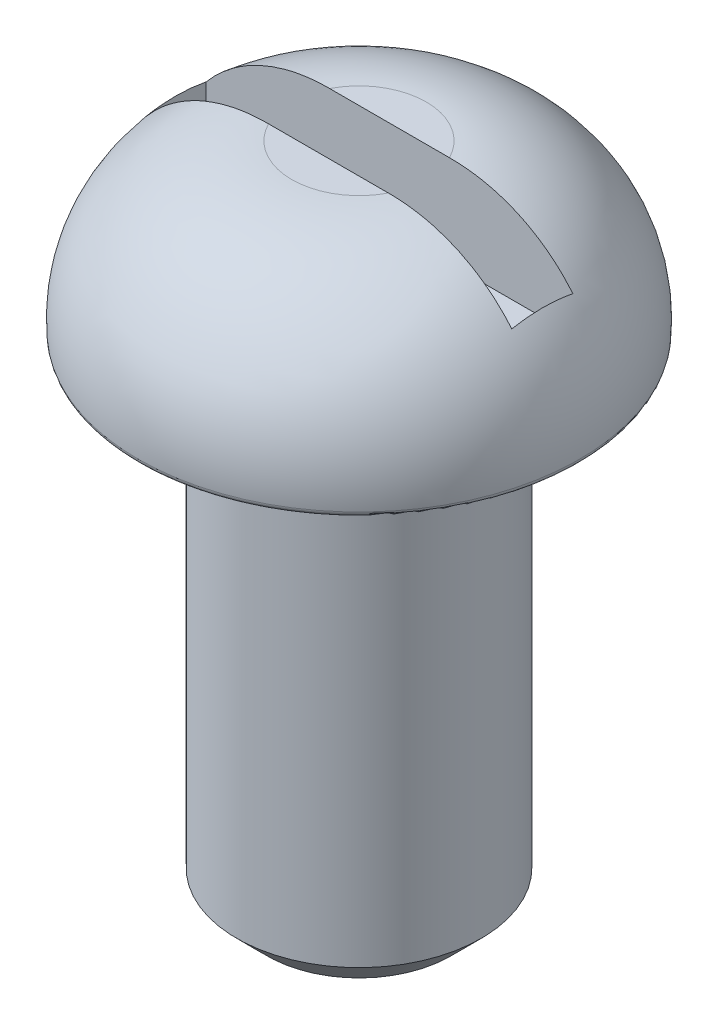
ISO-10303-21;
HEADER;
FILE_DESCRIPTION(('STEP AP214'),'2;1');
FILE_NAME('part.step','',(''),(''),'','','');
FILE_SCHEMA(('AUTOMOTIVE_DESIGN { 1 0 10303 214 1 1 1 1 }'));
ENDSEC;
DATA;
#1=APPLICATION_CONTEXT('core data for automotive mechanical design processes');
#2=APPLICATION_PROTOCOL_DEFINITION('international standard','automotive_design',2000,#1);
#3=PRODUCT_CONTEXT('',#1,'mechanical');
#4=PRODUCT('Part','Part','',(#3));
#5=PRODUCT_RELATED_PRODUCT_CATEGORY('part','',(#4));
#6=PRODUCT_DEFINITION_FORMATION('','',#4);
#7=PRODUCT_DEFINITION_CONTEXT('part definition',#1,'design');
#8=PRODUCT_DEFINITION('design','',#6,#7);
#9=PRODUCT_DEFINITION_SHAPE('','',#8);
#10=(LENGTH_UNIT() NAMED_UNIT(*) SI_UNIT(.MILLI.,.METRE.));
#11=(NAMED_UNIT(*) PLANE_ANGLE_UNIT() SI_UNIT($,.RADIAN.));
#12=(NAMED_UNIT(*) SI_UNIT($,.STERADIAN.) SOLID_ANGLE_UNIT());
#13=UNCERTAINTY_MEASURE_WITH_UNIT(LENGTH_MEASURE(1.E-05),#10,'distance_accuracy_value','');
#14=(GEOMETRIC_REPRESENTATION_CONTEXT(3) GLOBAL_UNCERTAINTY_ASSIGNED_CONTEXT((#13)) GLOBAL_UNIT_ASSIGNED_CONTEXT((#10,
#11,#12)) REPRESENTATION_CONTEXT('',''));
#15=CARTESIAN_POINT('',(0.,0.,0.));
#16=DIRECTION('',(0.,0.,1.));
#17=DIRECTION('',(1.,0.,0.));
#18=AXIS2_PLACEMENT_3D('',#15,#16,#17);
#19=CARTESIAN_POINT('',(0.,10.8,0.));
#20=DIRECTION('',(0.,1.,0.));
#21=DIRECTION('',(0.,0.,1.));
#22=AXIS2_PLACEMENT_3D('',#19,#20,#21);
#23=PLANE('',#22);
#24=DIRECTION('',(-1.,0.,0.));
#25=VECTOR('',#24,1.);
#26=CARTESIAN_POINT('',(-3.,10.8,-0.499999999999999));
#27=LINE('',#26,#25);
#28=CARTESIAN_POINT('',(0.979795897113272,10.8,-0.5));
#29=VERTEX_POINT('',#28);
#30=CARTESIAN_POINT('',(-0.979795897113272,10.8,-0.5));
#31=VERTEX_POINT('',#30);
#32=EDGE_CURVE('E107',#29,#31,#27,.T.);
#33=ORIENTED_EDGE('',*,*,#32,.F.);
#34=CARTESIAN_POINT('',(0.,10.8,0.));
#35=DIRECTION('',(0.,-1.,0.));
#36=DIRECTION('',(0.,0.,-1.));
#37=AXIS2_PLACEMENT_3D('',#34,#35,#36);
#38=CIRCLE('',#37,1.1);
#39=EDGE_CURVE('E130',#31,#29,#38,.T.);
#40=ORIENTED_EDGE('',*,*,#39,.F.);
#41=EDGE_LOOP('',(#33,#40));
#42=FACE_BOUND('',#41,.T.);
#43=ADVANCED_FACE('F31',(#42),#23,.T.);
#44=CARTESIAN_POINT('',(1.5,0.,0.));
#45=DIRECTION('',(0.,-1.,0.));
#46=DIRECTION('',(0.,0.,-1.));
#47=AXIS2_PLACEMENT_3D('',#44,#45,#46);
#48=PLANE('',#47);
#49=CARTESIAN_POINT('',(0.,0.,0.));
#50=DIRECTION('',(0.,-1.,0.));
#51=DIRECTION('',(0.,0.,-1.));
#52=AXIS2_PLACEMENT_3D('',#49,#50,#51);
#53=CIRCLE('',#52,1.5);
#54=CARTESIAN_POINT('',(0.,0.,-1.5));
#55=VERTEX_POINT('',#54);
#56=EDGE_CURVE('E117',#55,#55,#53,.T.);
#57=ORIENTED_EDGE('',*,*,#56,.T.);
#58=EDGE_LOOP('',(#57));
#59=FACE_BOUND('',#58,.T.);
#60=ADVANCED_FACE('F33',(#59),#48,.T.);
#61=DIRECTION('',(1.,0.,0.));
#62=VECTOR('',#61,1.);
#63=CARTESIAN_POINT('',(-3.,10.8,0.5));
#64=LINE('',#63,#62);
#65=CARTESIAN_POINT('',(-0.979795897113272,10.8,0.5));
#66=VERTEX_POINT('',#65);
#67=CARTESIAN_POINT('',(0.979795897113272,10.8,0.5));
#68=VERTEX_POINT('',#67);
#69=EDGE_CURVE('E109',#66,#68,#64,.T.);
#70=ORIENTED_EDGE('',*,*,#69,.F.);
#71=EDGE_CURVE('E133',#68,#66,#38,.T.);
#72=ORIENTED_EDGE('',*,*,#71,.F.);
#73=EDGE_LOOP('',(#70,#72));
#74=FACE_BOUND('',#73,.T.);
#75=ADVANCED_FACE('F178',(#74),#23,.T.);
#76=CARTESIAN_POINT('',(0.,8.28392857142857,0.));
#77=DIRECTION('',(0.,-1.,0.));
#78=DIRECTION('',(0.,0.,-1.));
#79=AXIS2_PLACEMENT_3D('',#76,#77,#78);
#80=DEGENERATE_TOROIDAL_SURFACE('',#79,1.1,2.51607142857143,.T.);
#81=CARTESIAN_POINT('',(0.,10.7274128528745,-0.5));
#82=CARTESIAN_POINT('',(-0.0422818392167979,10.7274165469385,-0.5));
#83=CARTESIAN_POINT('',(-0.0845648077539234,10.7287732759207,-0.5));
#84=CARTESIAN_POINT('',(-0.16903295112575,10.73371678296,-0.5));
#85=CARTESIAN_POINT('',(-0.211217957322735,10.7373061266983,-0.5));
#86=CARTESIAN_POINT('',(-0.295732319609198,10.7456873012372,-0.5));
#87=CARTESIAN_POINT('',(-0.338060855781322,10.7504867270946,-0.5));
#88=CARTESIAN_POINT('',(-0.42268796162483,10.7602672709482,-0.5));
#89=CARTESIAN_POINT('',(-0.464986535283327,10.7652483565223,-0.5));
#90=CARTESIAN_POINT('',(-0.549995859987487,10.7746908209025,-0.5));
#91=CARTESIAN_POINT('',(-0.592707150305704,10.7791476108338,-0.5));
#92=CARTESIAN_POINT('',(-0.678226998569676,10.7869875822783,-0.5));
#93=CARTESIAN_POINT('',(-0.721035552525858,10.7903708070542,-0.5));
#94=CARTESIAN_POINT('',(-0.84958950567168,10.7983765237565,-0.5));
#95=CARTESIAN_POINT('',(-0.935489790921104,10.8008585029768,-0.5));
#96=CARTESIAN_POINT('',(-1.1067831178282,10.7985979859046,-0.5));
#97=CARTESIAN_POINT('',(-1.19217649378594,10.7938926243803,-0.5));
#98=CARTESIAN_POINT('',(-1.36218346820903,10.7767110644375,-0.5));
#99=CARTESIAN_POINT('',(-1.44679694829237,10.7642337053806,-0.5));
#100=CARTESIAN_POINT('',(-1.67247179942634,10.7197885787204,-0.5));
#101=CARTESIAN_POINT('',(-1.81214349732275,10.6803108697752,-0.5));
#102=CARTESIAN_POINT('',(-2.08327243273732,10.578365307995,-0.5));
#103=CARTESIAN_POINT('',(-2.21470455040019,10.5158308048912,-0.5));
#104=CARTESIAN_POINT('',(-2.46503915559689,10.3692241175853,-0.5));
#105=CARTESIAN_POINT('',(-2.5839377708626,10.285145304561,-0.499999999999999));
#106=CARTESIAN_POINT('',(-2.80538188060228,10.0978739913003,-0.499999999999999));
#107=CARTESIAN_POINT('',(-2.90794452018514,9.99470177942185,-0.499999999999999));
#108=CARTESIAN_POINT('',(-3.09164169034083,9.77468570273218,-0.499999999999999));
#109=CARTESIAN_POINT('',(-3.17320287222632,9.6581978139942,-0.499999999999999));
#110=CARTESIAN_POINT('',(-3.31544644584769,9.41305955169074,-0.499999999999999));
#111=CARTESIAN_POINT('',(-3.37612390334343,9.28440631293368,-0.499999999999999));
#112=CARTESIAN_POINT('',(-3.47437212103018,9.01976923720552,-0.499999999999999));
#113=CARTESIAN_POINT('',(-3.5121288252665,8.88385439630765,-0.499999999999999));
#114=CARTESIAN_POINT('',(-3.56421697913353,8.60762139502178,-0.499999999999999));
#115=CARTESIAN_POINT('',(-3.57855112578794,8.46730374349831,-0.499999999999999));
#116=CARTESIAN_POINT('',(-3.58337884124122,8.18663409871115,-0.499999999999999));
#117=CARTESIAN_POINT('',(-3.57393572471911,8.04628318963348,-0.499999999999999));
#118=CARTESIAN_POINT('',(-3.5316141639522,7.76915049513041,-0.499999999999999));
#119=CARTESIAN_POINT('',(-3.498734095655,7.63236895772384,-0.499999999999999));
#120=CARTESIAN_POINT('',(-3.41049285796513,7.36628210405101,-0.499999999999999));
#121=CARTESIAN_POINT('',(-3.35513462872845,7.23697581254436,-0.499999999999999));
#122=CARTESIAN_POINT('',(-3.22354867158706,6.98949328322027,-0.499999999999999));
#123=CARTESIAN_POINT('',(-3.14732499631139,6.87131489005098,-0.499999999999999));
#124=CARTESIAN_POINT('',(-2.97603829937548,6.64915027308459,-0.499999999999999));
#125=CARTESIAN_POINT('',(-2.88093963719999,6.54519153648645,-0.499999999999999));
#126=CARTESIAN_POINT('',(-2.67467710760851,6.35454114342512,-0.499999999999999));
#127=CARTESIAN_POINT('',(-2.56350398798273,6.26785950020401,-0.5));
#128=CARTESIAN_POINT('',(-2.32755014511485,6.11360464345636,-0.5));
#129=CARTESIAN_POINT('',(-2.20268187759651,6.04616563243584,-0.5));
#130=CARTESIAN_POINT('',(-1.94368132676,5.93287698782177,-0.5));
#131=CARTESIAN_POINT('',(-1.80956257964428,5.8869965452354,-0.5));
#132=CARTESIAN_POINT('',(-1.60298474041263,5.83440882031757,-0.5));
#133=CARTESIAN_POINT('',(-1.53249789321916,5.81952122194781,-0.5));
#134=CARTESIAN_POINT('',(-1.39052442675912,5.79540495059233,-0.5));
#135=CARTESIAN_POINT('',(-1.3190374804625,5.78617817511717,-0.5));
#136=CARTESIAN_POINT('',(-1.17546901496844,5.77320390137064,-0.5));
#137=CARTESIAN_POINT('',(-1.10338674206885,5.76946497528774,-0.5));
#138=CARTESIAN_POINT('',(-0.959208808371292,5.76709451049405,-0.5));
#139=CARTESIAN_POINT('',(-0.887113210022952,5.76845867124155,-0.5));
#140=CARTESIAN_POINT('',(-0.775214024066887,5.77391123282925,-0.5));
#141=CARTESIAN_POINT('',(-0.735327198974333,5.77651597691304,-0.5));
#142=CARTESIAN_POINT('',(-0.655638244781421,5.78280735406635,-0.5));
#143=CARTESIAN_POINT('',(-0.615836118302233,5.78649402014144,-0.5));
#144=CARTESIAN_POINT('',(-0.536263508131231,5.79462144719697,-0.5));
#145=CARTESIAN_POINT('',(-0.496493120648774,5.79906311317887,-0.5));
#146=CARTESIAN_POINT('',(-0.416975805224193,5.80820548790677,-0.5));
#147=CARTESIAN_POINT('',(-0.377228883093883,5.81290624516751,-0.5));
#148=CARTESIAN_POINT('',(-0.297586444851773,5.82187883252253,-0.5));
#149=CARTESIAN_POINT('',(-0.25769080182081,5.82614959807181,-0.5));
#150=CARTESIAN_POINT('',(-0.177783910072658,5.83335474877311,-0.5));
#151=CARTESIAN_POINT('',(-0.137772712092002,5.83628965066493,-0.5));
#152=CARTESIAN_POINT('',(-0.0577077415049963,5.83999017238346,-0.5));
#153=CARTESIAN_POINT('',(-0.0176541585425305,5.84075949122909,-0.5));
#154=CARTESIAN_POINT('',(0.0624280292990354,5.83988319172582,-0.5));
#155=CARTESIAN_POINT('',(0.102456631415339,5.83823734184883,-0.5));
#156=CARTESIAN_POINT('',(0.200234845544321,5.83189818281024,-0.5));
#157=CARTESIAN_POINT('',(0.257909097546066,5.826171639196,-0.5));
#158=CARTESIAN_POINT('',(0.373130582436597,5.81349379269112,-0.5));
#159=CARTESIAN_POINT('',(0.430677721845475,5.80654177881028,-0.5));
#160=CARTESIAN_POINT('',(0.546015792537371,5.79352048271878,-0.5));
#161=CARTESIAN_POINT('',(0.603806980698211,5.78745323987419,-0.5));
#162=CARTESIAN_POINT('',(0.719564756314967,5.77745828343069,-0.5));
#163=CARTESIAN_POINT('',(0.777531278219115,5.77352985070593,-0.5));
#164=CARTESIAN_POINT('',(0.893172400195652,5.76854275544782,-0.5));
#165=CARTESIAN_POINT('',(0.950846012476754,5.76746320269116,-0.5));
#166=CARTESIAN_POINT('',(1.06616353736375,5.76851252292201,-0.5));
#167=CARTESIAN_POINT('',(1.12380744653326,5.77064170814559,-0.5));
#168=CARTESIAN_POINT('',(1.29646264418287,5.78223867600054,-0.5));
#169=CARTESIAN_POINT('',(1.41119794735551,5.79691584185622,-0.5));
#170=CARTESIAN_POINT('',(1.59489926285845,5.83261559149393,-0.5));
#171=CARTESIAN_POINT('',(1.66477164806265,5.84914222822954,-0.5));
#172=CARTESIAN_POINT('',(1.80287380943863,5.88784500339178,-0.5));
#173=CARTESIAN_POINT('',(1.8711047501223,5.91001699914347,-0.5));
#174=CARTESIAN_POINT('',(2.07410752672873,5.98549592029451,-0.5));
#175=CARTESIAN_POINT('',(2.20577330597763,6.04749461160393,-0.5));
#176=CARTESIAN_POINT('',(2.45633142382588,6.19288225773033,-0.5));
#177=CARTESIAN_POINT('',(2.57524579148441,6.27623345148029,-0.5));
#178=CARTESIAN_POINT('',(2.79655315203983,6.46171351618865,-0.5));
#179=CARTESIAN_POINT('',(2.89901563927389,6.56375928253145,-0.5));
#180=CARTESIAN_POINT('',(3.08333361106216,6.78206180281883,-0.5));
#181=CARTESIAN_POINT('',(3.16550705350707,6.89805031237571,-0.5));
#182=CARTESIAN_POINT('',(3.30914359276284,7.14243512151083,-0.5));
#183=CARTESIAN_POINT('',(3.37057811060937,7.27084823183649,-0.5));
#184=CARTESIAN_POINT('',(3.47032106842233,7.53507437796322,-0.5));
#185=CARTESIAN_POINT('',(3.50882693864908,7.67081292873242,-0.5));
#186=CARTESIAN_POINT('',(3.562418994764,7.94677909958349,-0.5));
#187=CARTESIAN_POINT('',(3.5775152322762,8.08700476657572,-0.5));
#188=CARTESIAN_POINT('',(3.58387202437275,8.36763441034357,-0.5));
#189=CARTESIAN_POINT('',(3.57519350318312,8.5080370115194,-0.5));
#190=CARTESIAN_POINT('',(3.53438074581866,8.7854018053742,-0.5));
#191=CARTESIAN_POINT('',(3.50224468403048,8.92236372941982,-0.5));
#192=CARTESIAN_POINT('',(3.41545623121341,9.18891178477867,-0.5));
#193=CARTESIAN_POINT('',(3.36081037331555,9.31850004377765,-0.5));
#194=CARTESIAN_POINT('',(3.23057736221934,9.56669297613496,-0.5));
#195=CARTESIAN_POINT('',(3.15498920043748,9.68529712013004,-0.5));
#196=CARTESIAN_POINT('',(2.98487308180984,9.90843444683799,-0.5));
#197=CARTESIAN_POINT('',(2.89030540717658,10.0129373402992,-0.5));
#198=CARTESIAN_POINT('',(2.68507678186927,10.2046766626584,-0.5));
#199=CARTESIAN_POINT('',(2.5744185663433,10.2919160201574,-0.5));
#200=CARTESIAN_POINT('',(2.33946571548053,10.4473274485581,-0.5));
#201=CARTESIAN_POINT('',(2.21509014848476,10.5153768973344,-0.5));
#202=CARTESIAN_POINT('',(1.95675563445144,10.630063192075,-0.5));
#203=CARTESIAN_POINT('',(1.8227946326022,10.6766954308819,-0.5));
#204=CARTESIAN_POINT('',(1.61639044375143,10.7303876442397,-0.5));
#205=CARTESIAN_POINT('',(1.54596802681154,10.7456415870901,-0.5));
#206=CARTESIAN_POINT('',(1.40410609749614,10.7704800220143,-0.5));
#207=CARTESIAN_POINT('',(1.33266644460989,10.7800637229235,-0.5));
#208=CARTESIAN_POINT('',(1.18926106846354,10.7937239152555,-0.5));
#209=CARTESIAN_POINT('',(1.11729524330599,10.7977993099373,-0.5));
#210=CARTESIAN_POINT('',(0.973303073568274,10.8008297297292,-0.5));
#211=CARTESIAN_POINT('',(0.9012767773404,10.7997873179085,-0.5));
#212=CARTESIAN_POINT('',(0.759833351892089,10.79343428097,-0.5));
#213=CARTESIAN_POINT('',(0.690409077868162,10.788266687451,-0.5));
#214=CARTESIAN_POINT('',(0.586441263183597,10.778462989301,-0.5));
#215=CARTESIAN_POINT('',(0.551792076389235,10.7748501718974,-0.5));
#216=CARTESIAN_POINT('',(0.482536872530976,10.7672277908683,-0.5));
#217=CARTESIAN_POINT('',(0.447930856213372,10.7632182204778,-0.5));
#218=CARTESIAN_POINT('',(0.378954746753075,10.7552063552449,-0.5));
#219=CARTESIAN_POINT('',(0.344584635203562,10.751204193439,-0.5));
#220=CARTESIAN_POINT('',(0.275788988001553,10.7436731451844,-0.5));
#221=CARTESIAN_POINT('',(0.241363450768216,10.7401442724858,-0.5));
#222=CARTESIAN_POINT('',(0.172485362325034,10.7341476882484,-0.5));
#223=CARTESIAN_POINT('',(0.138033012391917,10.7316778085475,-0.5));
#224=CARTESIAN_POINT('',(0.0690540126144134,10.7283090732424,-0.5));
#225=CARTESIAN_POINT('',(0.0345273828434016,10.727409836299,-0.5));
#226=CARTESIAN_POINT('',(0.,10.7274128528745,-0.5));
#227=B_SPLINE_CURVE_WITH_KNOTS('',3,(#81,#82,#83,#84,#85,#86,#87,#88,#89,#90,#91,#92,#93,#94,
#95,#96,#97,#98,#99,#100,#101,#102,#103,#104,#105,#106,#107,#108,#109,#110,#111,#112,#113,#114,
#115,#116,#117,#118,#119,#120,#121,#122,#123,#124,#125,#126,#127,#128,#129,#130,#131,#132,#133,
#134,#135,#136,#137,#138,#139,#140,#141,#142,#143,#144,#145,#146,#147,#148,#149,#150,#151,#152,
#153,#154,#155,#156,#157,#158,#159,#160,#161,#162,#163,#164,#165,#166,#167,#168,#169,#170,#171,
#172,#173,#174,#175,#176,#177,#178,#179,#180,#181,#182,#183,#184,#185,#186,#187,#188,#189,#190,
#191,#192,#193,#194,#195,#196,#197,#198,#199,#200,#201,#202,#203,#204,#205,#206,#207,#208,#209,
#210,#211,#212,#213,#214,#215,#216,#217,#218,#219,#220,#221,#222,#223,#224,#225,#226),
.UNSPECIFIED.,.T.,.F.,(4,2,2,2,2,2,2,2,2,2,2,2,2,2,2,2,2,2,2,2,2,2,2,2,2,2,2,2,2,2,2,2,2,2,2,2,
2,2,2,2,2,2,2,2,2,2,2,2,2,2,2,2,2,2,2,2,2,2,2,2,2,2,2,2,2,2,2,2,2,2,2,2,4),(0.,
0.126832445010955,0.253810913582559,0.381607112858121,0.509380614001818,0.638200232580602,
0.767014659317311,1.02456319614758,1.28078555308018,1.53704618238923,1.97035679177588,
2.40492991997873,2.83963691992653,3.27388463166759,3.69845356976823,4.12312275288421,
4.54429910250408,4.96542695175598,5.38543459801148,5.80547135132612,6.22545318128816,
6.64535349732551,7.06605436134676,7.48699834543457,7.91081008137102,8.33401429898668,
8.54994817728238,8.76595439722896,8.9822976677333,9.19845865962705,9.31836039848569,
9.43826579549813,9.55831594725931,9.67838865524539,9.79875167646173,9.91906809911172,
10.0391788849595,10.1593011858772,10.3331086877597,10.507017362734,10.6813207613517,
10.8555655181996,11.0285289789845,11.2015092715958,11.5474682304916,11.7626498055027,
11.9776739288769,12.4119939426601,12.8455511178588,13.2772257761513,13.7016312130657,
14.1266191306346,14.547892631159,14.968985195205,15.3889996947157,15.8090468858825,
16.2289722504485,16.6489178421799,17.0697515792289,17.4905138643667,17.9139068279665,
18.3373908270174,18.5533648573046,18.7693690151815,18.9854161746131,19.2013551456427,
19.4101160847006,19.5146257294316,19.6191371564655,19.7229443364761,19.8267545316491,
19.9303511609617,20.0339226343643),.UNSPECIFIED.);
#228=CARTESIAN_POINT('',(3.,9.88444543075919,-0.5));
#229=VERTEX_POINT('',#228);
#230=EDGE_CURVE('E11',#229,#29,#227,.T.);
#231=ORIENTED_EDGE('',*,*,#230,.F.);
#232=CARTESIAN_POINT('',(3.,9.93335739186111,0.));
#233=CARTESIAN_POINT('',(3.,9.93336461310188,-0.154184867381827));
#234=CARTESIAN_POINT('',(3.,9.9197293123384,-0.308634480967941));
#235=CARTESIAN_POINT('',(3.,9.8641803133891,-0.612738389217278));
#236=CARTESIAN_POINT('',(3.,9.82222092261654,-0.762384525623875));
#237=CARTESIAN_POINT('',(3.,9.72526504634106,-1.00661273643669));
#238=CARTESIAN_POINT('',(3.,9.67795204285815,-1.10424950305777));
#239=CARTESIAN_POINT('',(3.,9.56812874673176,-1.29045349555034));
#240=CARTESIAN_POINT('',(3.,9.50565260783125,-1.37904047693242));
#241=CARTESIAN_POINT('',(3.,9.37642763604719,-1.53098505261685));
#242=CARTESIAN_POINT('',(3.,9.31178499758491,-1.59612980062483));
#243=CARTESIAN_POINT('',(3.,9.17252784832791,-1.71483755019827));
#244=CARTESIAN_POINT('',(3.,9.09791362605457,-1.7684008867471));
#245=CARTESIAN_POINT('',(3.,8.93986928154161,-1.86168486276998));
#246=CARTESIAN_POINT('',(3.,8.85639334468504,-1.9013284970785));
#247=CARTESIAN_POINT('',(3.,8.68345548001444,-1.96417971442271));
#248=CARTESIAN_POINT('',(3.,8.59399675278274,-1.98739600973284));
#249=CARTESIAN_POINT('',(3.,8.42161625631113,-2.01456662623953));
#250=CARTESIAN_POINT('',(3.,8.33896414326272,-2.02025116068091));
#251=CARTESIAN_POINT('',(3.,8.17396136136139,-2.01701940234604));
#252=CARTESIAN_POINT('',(3.,8.09161060386738,-2.0081078190201));
#253=CARTESIAN_POINT('',(3.,7.93300956772154,-1.97678912412979));
#254=CARTESIAN_POINT('',(3.,7.85664726495929,-1.95494243069133));
#255=CARTESIAN_POINT('',(3.,7.70847862984289,-1.89919651953525));
#256=CARTESIAN_POINT('',(3.,7.63667257392385,-1.86529657134894));
#257=CARTESIAN_POINT('',(3.,7.49655995404805,-1.78530449862206));
#258=CARTESIAN_POINT('',(3.,7.42849253275641,-1.73879537527413));
#259=CARTESIAN_POINT('',(3.,7.30018735152327,-1.63603856746415));
#260=CARTESIAN_POINT('',(3.,7.23995223263282,-1.5797876128911));
#261=CARTESIAN_POINT('',(3.,7.1220309802308,-1.45293717811816));
#262=CARTESIAN_POINT('',(3.,7.06530665862844,-1.3814465069673));
#263=CARTESIAN_POINT('',(3.,6.96265526497357,-1.23112499349274));
#264=CARTESIAN_POINT('',(3.,6.91673383716525,-1.15229034401645));
#265=CARTESIAN_POINT('',(3.,6.82875737127662,-0.975617614991072));
#266=CARTESIAN_POINT('',(3.,6.7886493227128,-0.876812512176412));
#267=CARTESIAN_POINT('',(3.,6.72245308968346,-0.674638460242954));
#268=CARTESIAN_POINT('',(3.,6.69637374778571,-0.571266676967369));
#269=CARTESIAN_POINT('',(3.,6.6536975094114,-0.340828407679238));
#270=CARTESIAN_POINT('',(3.,6.64009224889631,-0.213204469845908));
#271=CARTESIAN_POINT('',(3.,6.63169621338285,0.0427984108447423));
#272=CARTESIAN_POINT('',(3.,6.63693331736424,0.171178191636853));
#273=CARTESIAN_POINT('',(3.,6.66847011687393,0.442720920924668));
#274=CARTESIAN_POINT('',(3.,6.69747296739361,0.585584555395528));
#275=CARTESIAN_POINT('',(3.,6.78140978260964,0.863438437540755));
#276=CARTESIAN_POINT('',(3.,6.83628764493806,0.998445012889438));
#277=CARTESIAN_POINT('',(3.,6.95245676424918,1.21509293732962));
#278=CARTESIAN_POINT('',(3.,7.00675082641463,1.3004978897973));
#279=CARTESIAN_POINT('',(3.,7.12857283936112,1.46135850667191));
#280=CARTESIAN_POINT('',(3.,7.19609339333045,1.5368196927775));
#281=CARTESIAN_POINT('',(3.,7.34420546062528,1.67504434566068));
#282=CARTESIAN_POINT('',(3.,7.42489660236604,1.73770211736695));
#283=CARTESIAN_POINT('',(3.,7.59701464073841,1.84603763329798));
#284=CARTESIAN_POINT('',(3.,7.68843313843661,1.89172854644452));
#285=CARTESIAN_POINT('',(3.,7.86596926658714,1.95838497974242));
#286=CARTESIAN_POINT('',(3.,7.95115367974155,1.98184459035223));
#287=CARTESIAN_POINT('',(3.,8.12438427971692,2.01256302199119));
#288=CARTESIAN_POINT('',(3.,8.21242861197037,2.01983213735679));
#289=CARTESIAN_POINT('',(3.,8.38043615698326,2.01787478754687));
#290=CARTESIAN_POINT('',(3.,8.46041959931175,2.01006202839145));
#291=CARTESIAN_POINT('',(3.,8.6179061731293,1.9810650617856));
#292=CARTESIAN_POINT('',(3.,8.69540966463317,1.9598828045252));
#293=CARTESIAN_POINT('',(3.,8.84567445351991,1.90517607155327));
#294=CARTESIAN_POINT('',(3.,8.91844739026499,1.87168335157832));
#295=CARTESIAN_POINT('',(3.,9.05784039456533,1.79373433512546));
#296=CARTESIAN_POINT('',(3.,9.1244590265385,1.74927548946905));
#297=CARTESIAN_POINT('',(3.,9.25487134734267,1.64750728180445));
#298=CARTESIAN_POINT('',(3.,9.31812404124668,1.58950721373673));
#299=CARTESIAN_POINT('',(3.,9.43539516716216,1.46486839496237));
#300=CARTESIAN_POINT('',(3.,9.48941078608306,1.39822702342906));
#301=CARTESIAN_POINT('',(3.,9.59462527161511,1.24870293407759));
#302=CARTESIAN_POINT('',(3.,9.64443363165447,1.16484490536443));
#303=CARTESIAN_POINT('',(3.,9.73186070837905,0.990966421645668));
#304=CARTESIAN_POINT('',(3.,9.7694655249968,0.900939079994879));
#305=CARTESIAN_POINT('',(3.,9.83894291603378,0.699207880366171));
#306=CARTESIAN_POINT('',(3.,9.86833787364544,0.586655008454972));
#307=CARTESIAN_POINT('',(3.,9.91112455360347,0.358730572586325));
#308=CARTESIAN_POINT('',(3.,9.92453952921339,0.243363354188533));
#309=CARTESIAN_POINT('',(3.,9.93231181967244,0.085185959688303));
#310=CARTESIAN_POINT('',(3.,9.93335539654763,0.0426030862879905));
#311=CARTESIAN_POINT('',(3.,9.93335739186111,0.));
#312=B_SPLINE_CURVE_WITH_KNOTS('',3,(#232,#233,#234,#235,#236,#237,#238,#239,#240,#241,#242,
#243,#244,#245,#246,#247,#248,#249,#250,#251,#252,#253,#254,#255,#256,#257,#258,#259,#260,#261,
#262,#263,#264,#265,#266,#267,#268,#269,#270,#271,#272,#273,#274,#275,#276,#277,#278,#279,#280,
#281,#282,#283,#284,#285,#286,#287,#288,#289,#290,#291,#292,#293,#294,#295,#296,#297,#298,#299,
#300,#301,#302,#303,#304,#305,#306,#307,#308,#309,#310,#311),.UNSPECIFIED.,.T.,.F.,(4,2,2,2,2,2,
2,2,2,2,2,2,2,2,2,2,2,2,2,2,2,2,2,2,2,2,2,2,2,2,2,2,2,2,2,2,2,2,2,4),(0.,0.462418793853954,
0.925585352802772,1.24985033038329,1.57339159717828,1.84756997016048,2.12174041168414,
2.39740454050721,2.67292236046499,2.92020383836321,3.16740554639014,3.40460893901155,
3.6418267094253,3.88812413472772,4.13450439728723,4.40723838781147,4.68011456016615,
4.9988530127053,5.31779213759775,5.70134864783786,6.08547289779954,6.52057767545824,
6.95474336411365,7.2571856094031,7.55945919664367,7.86413539925473,8.1685746289986,
8.43218694030348,8.6956315921638,8.93557458959559,9.17548259496344,9.41477603433159,
9.65412515220915,9.9105574888536,10.1670677817415,10.4585857025945,10.7504345118766,
11.0981845309878,11.4454279012428,11.5731996346838),.UNSPECIFIED.);
#313=CARTESIAN_POINT('',(3.,9.88444543075925,0.5));
#314=VERTEX_POINT('',#313);
#315=EDGE_CURVE('E35',#314,#229,#312,.T.);
#316=ORIENTED_EDGE('',*,*,#315,.F.);
#317=CARTESIAN_POINT('',(0.,10.7274128528745,0.5));
#318=CARTESIAN_POINT('',(0.0422818392167981,10.7274165469385,0.5));
#319=CARTESIAN_POINT('',(0.0845648077539236,10.7287732759207,0.5));
#320=CARTESIAN_POINT('',(0.16903295112575,10.73371678296,0.5));
#321=CARTESIAN_POINT('',(0.211217957322736,10.7373061266983,0.5));
#322=CARTESIAN_POINT('',(0.295732319609198,10.7456873012372,0.5));
#323=CARTESIAN_POINT('',(0.338060855781323,10.7504867270946,0.5));
#324=CARTESIAN_POINT('',(0.422687961624831,10.7602672709482,0.5));
#325=CARTESIAN_POINT('',(0.464986535283327,10.7652483565223,0.5));
#326=CARTESIAN_POINT('',(0.549995859987488,10.7746908209025,0.5));
#327=CARTESIAN_POINT('',(0.592707150305705,10.7791476108338,0.5));
#328=CARTESIAN_POINT('',(0.678226998569677,10.7869875822783,0.5));
#329=CARTESIAN_POINT('',(0.721035552525859,10.7903708070542,0.5));
#330=CARTESIAN_POINT('',(0.849589505671681,10.7983765237565,0.5));
#331=CARTESIAN_POINT('',(0.935489790921105,10.8008585029768,0.5));
#332=CARTESIAN_POINT('',(1.1067831178282,10.7985979859046,0.5));
#333=CARTESIAN_POINT('',(1.19217649378594,10.7938926243803,0.5));
#334=CARTESIAN_POINT('',(1.36218346820903,10.7767110644375,0.5));
#335=CARTESIAN_POINT('',(1.44679694829237,10.7642337053806,0.5));
#336=CARTESIAN_POINT('',(1.67247179942634,10.7197885787204,0.5));
#337=CARTESIAN_POINT('',(1.81214349732276,10.6803108697752,0.5));
#338=CARTESIAN_POINT('',(2.08327243273732,10.578365307995,0.5));
#339=CARTESIAN_POINT('',(2.2147045504002,10.5158308048912,0.5));
#340=CARTESIAN_POINT('',(2.46503915559689,10.3692241175853,0.5));
#341=CARTESIAN_POINT('',(2.5839377708626,10.285145304561,0.5));
#342=CARTESIAN_POINT('',(2.80538188060228,10.0978739913003,0.5));
#343=CARTESIAN_POINT('',(2.90794452018514,9.99470177942185,0.5));
#344=CARTESIAN_POINT('',(3.09164169034083,9.77468570273218,0.5));
#345=CARTESIAN_POINT('',(3.17320287222632,9.6581978139942,0.5));
#346=CARTESIAN_POINT('',(3.31544644584769,9.41305955169074,0.5));
#347=CARTESIAN_POINT('',(3.37612390334343,9.28440631293368,0.5));
#348=CARTESIAN_POINT('',(3.47437212103018,9.01976923720552,0.5));
#349=CARTESIAN_POINT('',(3.5121288252665,8.88385439630765,0.5));
#350=CARTESIAN_POINT('',(3.56421697913353,8.60762139502178,0.5));
#351=CARTESIAN_POINT('',(3.57855112578794,8.46730374349831,0.5));
#352=CARTESIAN_POINT('',(3.58337884124122,8.18663409871115,0.5));
#353=CARTESIAN_POINT('',(3.57393572471911,8.04628318963348,0.5));
#354=CARTESIAN_POINT('',(3.5316141639522,7.76915049513041,0.5));
#355=CARTESIAN_POINT('',(3.498734095655,7.63236895772384,0.5));
#356=CARTESIAN_POINT('',(3.41049285796513,7.36628210405101,0.5));
#357=CARTESIAN_POINT('',(3.35513462872845,7.23697581254436,0.5));
#358=CARTESIAN_POINT('',(3.22354867158706,6.98949328322026,0.5));
#359=CARTESIAN_POINT('',(3.14732499631139,6.87131489005098,0.5));
#360=CARTESIAN_POINT('',(2.97603829937548,6.64915027308459,0.5));
#361=CARTESIAN_POINT('',(2.88093963719999,6.54519153648645,0.5));
#362=CARTESIAN_POINT('',(2.67467710760851,6.35454114342512,0.5));
#363=CARTESIAN_POINT('',(2.56350398798273,6.26785950020401,0.5));
#364=CARTESIAN_POINT('',(2.32755014511485,6.11360464345636,0.5));
#365=CARTESIAN_POINT('',(2.20268187759651,6.04616563243584,0.5));
#366=CARTESIAN_POINT('',(1.94368132676,5.93287698782177,0.5));
#367=CARTESIAN_POINT('',(1.80956257964428,5.88699654523539,0.5));
#368=CARTESIAN_POINT('',(1.60298474041263,5.83440882031757,0.5));
#369=CARTESIAN_POINT('',(1.53249789321916,5.81952122194781,0.5));
#370=CARTESIAN_POINT('',(1.39052442675912,5.79540495059233,0.5));
#371=CARTESIAN_POINT('',(1.3190374804625,5.78617817511717,0.5));
#372=CARTESIAN_POINT('',(1.17546901496844,5.77320390137064,0.5));
#373=CARTESIAN_POINT('',(1.10338674206884,5.76946497528774,0.5));
#374=CARTESIAN_POINT('',(0.95920880837129,5.76709451049405,0.5));
#375=CARTESIAN_POINT('',(0.88711321002295,5.76845867124155,0.5));
#376=CARTESIAN_POINT('',(0.775214024066885,5.77391123282925,0.5));
#377=CARTESIAN_POINT('',(0.735327198974331,5.77651597691304,0.5));
#378=CARTESIAN_POINT('',(0.65563824478142,5.78280735406635,0.5));
#379=CARTESIAN_POINT('',(0.615836118302232,5.78649402014144,0.5));
#380=CARTESIAN_POINT('',(0.536263508131231,5.79462144719697,0.5));
#381=CARTESIAN_POINT('',(0.496493120648774,5.79906311317887,0.5));
#382=CARTESIAN_POINT('',(0.416975805224193,5.80820548790677,0.5));
#383=CARTESIAN_POINT('',(0.377228883093883,5.81290624516751,0.5));
#384=CARTESIAN_POINT('',(0.297586444851773,5.82187883252253,0.5));
#385=CARTESIAN_POINT('',(0.25769080182081,5.82614959807181,0.5));
#386=CARTESIAN_POINT('',(0.177783910072657,5.83335474877311,0.5));
#387=CARTESIAN_POINT('',(0.137772712092,5.83628965066493,0.5));
#388=CARTESIAN_POINT('',(0.057707741504995,5.83999017238346,0.5));
#389=CARTESIAN_POINT('',(0.0176541585425298,5.84075949122909,0.5));
#390=CARTESIAN_POINT('',(-0.0624280292990362,5.83988319172582,0.5));
#391=CARTESIAN_POINT('',(-0.10245663141534,5.83823734184883,0.5));
#392=CARTESIAN_POINT('',(-0.200234845544323,5.83189818281024,0.5));
#393=CARTESIAN_POINT('',(-0.257909097546068,5.826171639196,0.5));
#394=CARTESIAN_POINT('',(-0.373130582436599,5.81349379269112,0.5));
#395=CARTESIAN_POINT('',(-0.430677721845478,5.80654177881028,0.5));
#396=CARTESIAN_POINT('',(-0.546015792537372,5.79352048271878,0.5));
#397=CARTESIAN_POINT('',(-0.603806980698212,5.78745323987419,0.5));
#398=CARTESIAN_POINT('',(-0.719564756314967,5.77745828343069,0.5));
#399=CARTESIAN_POINT('',(-0.777531278219116,5.77352985070593,0.5));
#400=CARTESIAN_POINT('',(-0.893172400195652,5.76854275544782,0.5));
#401=CARTESIAN_POINT('',(-0.950846012476754,5.76746320269116,0.5));
#402=CARTESIAN_POINT('',(-1.06616353736375,5.76851252292201,0.5));
#403=CARTESIAN_POINT('',(-1.12380744653326,5.77064170814559,0.5));
#404=CARTESIAN_POINT('',(-1.29646264418287,5.78223867600054,0.5));
#405=CARTESIAN_POINT('',(-1.4111979473555,5.79691584185622,0.5));
#406=CARTESIAN_POINT('',(-1.59489926285844,5.83261559149393,0.5));
#407=CARTESIAN_POINT('',(-1.66477164806264,5.84914222822954,0.5));
#408=CARTESIAN_POINT('',(-1.80287380943863,5.88784500339178,0.5));
#409=CARTESIAN_POINT('',(-1.87110475012229,5.91001699914347,0.5));
#410=CARTESIAN_POINT('',(-2.07410752672873,5.98549592029451,0.5));
#411=CARTESIAN_POINT('',(-2.20577330597762,6.04749461160393,0.5));
#412=CARTESIAN_POINT('',(-2.45633142382588,6.19288225773032,0.5));
#413=CARTESIAN_POINT('',(-2.5752457914844,6.27623345148029,0.5));
#414=CARTESIAN_POINT('',(-2.79655315203982,6.46171351618864,0.5));
#415=CARTESIAN_POINT('',(-2.89901563927389,6.56375928253144,0.5));
#416=CARTESIAN_POINT('',(-3.08333361106216,6.78206180281882,0.5));
#417=CARTESIAN_POINT('',(-3.16550705350707,6.89805031237571,0.5));
#418=CARTESIAN_POINT('',(-3.30914359276283,7.14243512151083,0.5));
#419=CARTESIAN_POINT('',(-3.37057811060937,7.27084823183649,0.5));
#420=CARTESIAN_POINT('',(-3.47032106842233,7.53507437796322,0.5));
#421=CARTESIAN_POINT('',(-3.50882693864908,7.67081292873242,0.500000000000001));
#422=CARTESIAN_POINT('',(-3.562418994764,7.94677909958348,0.500000000000001));
#423=CARTESIAN_POINT('',(-3.5775152322762,8.08700476657572,0.500000000000001));
#424=CARTESIAN_POINT('',(-3.58387202437275,8.36763441034357,0.500000000000001));
#425=CARTESIAN_POINT('',(-3.57519350318312,8.50803701151939,0.500000000000001));
#426=CARTESIAN_POINT('',(-3.53438074581867,8.7854018053742,0.500000000000001));
#427=CARTESIAN_POINT('',(-3.50224468403048,8.92236372941981,0.5));
#428=CARTESIAN_POINT('',(-3.41545623121342,9.18891178477867,0.5));
#429=CARTESIAN_POINT('',(-3.36081037331555,9.31850004377764,0.5));
#430=CARTESIAN_POINT('',(-3.23057736221934,9.56669297613496,0.5));
#431=CARTESIAN_POINT('',(-3.15498920043748,9.68529712013004,0.5));
#432=CARTESIAN_POINT('',(-2.98487308180984,9.90843444683799,0.5));
#433=CARTESIAN_POINT('',(-2.89030540717658,10.0129373402992,0.5));
#434=CARTESIAN_POINT('',(-2.68507678186927,10.2046766626584,0.5));
#435=CARTESIAN_POINT('',(-2.5744185663433,10.2919160201574,0.5));
#436=CARTESIAN_POINT('',(-2.33946571548053,10.4473274485581,0.5));
#437=CARTESIAN_POINT('',(-2.21509014848477,10.5153768973344,0.5));
#438=CARTESIAN_POINT('',(-1.95675563445145,10.630063192075,0.5));
#439=CARTESIAN_POINT('',(-1.8227946326022,10.6766954308819,0.5));
#440=CARTESIAN_POINT('',(-1.61639044375143,10.7303876442397,0.5));
#441=CARTESIAN_POINT('',(-1.54596802681154,10.7456415870901,0.5));
#442=CARTESIAN_POINT('',(-1.40410609749614,10.7704800220143,0.5));
#443=CARTESIAN_POINT('',(-1.33266644460989,10.7800637229235,0.5));
#444=CARTESIAN_POINT('',(-1.18926106846355,10.7937239152555,0.5));
#445=CARTESIAN_POINT('',(-1.11729524330599,10.7977993099373,0.5));
#446=CARTESIAN_POINT('',(-0.973303073568276,10.8008297297292,0.5));
#447=CARTESIAN_POINT('',(-0.901276777340403,10.7997873179085,0.5));
#448=CARTESIAN_POINT('',(-0.759833351892093,10.79343428097,0.5));
#449=CARTESIAN_POINT('',(-0.690409077868166,10.788266687451,0.5));
#450=CARTESIAN_POINT('',(-0.5864412631836,10.778462989301,0.5));
#451=CARTESIAN_POINT('',(-0.551792076389236,10.7748501718974,0.5));
#452=CARTESIAN_POINT('',(-0.482536872530977,10.7672277908683,0.5));
#453=CARTESIAN_POINT('',(-0.447930856213373,10.7632182204778,0.5));
#454=CARTESIAN_POINT('',(-0.378954746753076,10.7552063552449,0.5));
#455=CARTESIAN_POINT('',(-0.344584635203563,10.751204193439,0.5));
#456=CARTESIAN_POINT('',(-0.275788988001553,10.7436731451844,0.5));
#457=CARTESIAN_POINT('',(-0.241363450768216,10.7401442724858,0.5));
#458=CARTESIAN_POINT('',(-0.172485362325034,10.7341476882484,0.5));
#459=CARTESIAN_POINT('',(-0.138033012391917,10.7316778085475,0.5));
#460=CARTESIAN_POINT('',(-0.0690540126144134,10.7283090732424,0.5));
#461=CARTESIAN_POINT('',(-0.0345273828434015,10.727409836299,0.5));
#462=CARTESIAN_POINT('',(0.,10.7274128528745,0.5));
#463=B_SPLINE_CURVE_WITH_KNOTS('',3,(#317,#318,#319,#320,#321,#322,#323,#324,#325,#326,#327,
#328,#329,#330,#331,#332,#333,#334,#335,#336,#337,#338,#339,#340,#341,#342,#343,#344,#345,#346,
#347,#348,#349,#350,#351,#352,#353,#354,#355,#356,#357,#358,#359,#360,#361,#362,#363,#364,#365,
#366,#367,#368,#369,#370,#371,#372,#373,#374,#375,#376,#377,#378,#379,#380,#381,#382,#383,#384,
#385,#386,#387,#388,#389,#390,#391,#392,#393,#394,#395,#396,#397,#398,#399,#400,#401,#402,#403,
#404,#405,#406,#407,#408,#409,#410,#411,#412,#413,#414,#415,#416,#417,#418,#419,#420,#421,#422,
#423,#424,#425,#426,#427,#428,#429,#430,#431,#432,#433,#434,#435,#436,#437,#438,#439,#440,#441,
#442,#443,#444,#445,#446,#447,#448,#449,#450,#451,#452,#453,#454,#455,#456,#457,#458,#459,#460,
#461,#462),.UNSPECIFIED.,.T.,.F.,(4,2,2,2,2,2,2,2,2,2,2,2,2,2,2,2,2,2,2,2,2,2,2,2,2,2,2,2,2,2,2,
2,2,2,2,2,2,2,2,2,2,2,2,2,2,2,2,2,2,2,2,2,2,2,2,2,2,2,2,2,2,2,2,2,2,2,2,2,2,2,2,2,4),(0.,
0.126832445010955,0.25381091358256,0.381607112858121,0.509380614001818,0.638200232580602,
0.767014659317312,1.02456319614758,1.28078555308018,1.53704618238923,1.97035679177588,
2.40492991997873,2.83963691992653,3.27388463166759,3.69845356976823,4.12312275288421,
4.54429910250408,4.96542695175598,5.38543459801147,5.80547135132612,6.22545318128816,
6.64535349732551,7.06605436134676,7.48699834543456,7.91081008137102,8.33401429898668,
8.54994817728238,8.76595439722896,8.9822976677333,9.19845865962705,9.31836039848569,
9.43826579549813,9.55831594725931,9.67838865524539,9.79875167646172,9.91906809911172,
10.0391788849595,10.1593011858772,10.3331086877597,10.507017362734,10.6813207613517,
10.8555655181996,11.0285289789845,11.2015092715958,11.5474682304916,11.7626498055027,
11.9776739288769,12.4119939426601,12.8455511178588,13.2772257761513,13.7016312130657,
14.1266191306346,14.547892631159,14.968985195205,15.3889996947157,15.8090468858825,
16.2289722504485,16.6489178421799,17.0697515792289,17.4905138643667,17.9139068279665,
18.3373908270173,18.5533648573046,18.7693690151815,18.9854161746131,19.2013551456427,
19.4101160847006,19.5146257294316,19.6191371564655,19.7229443364761,19.8267545316491,
19.9303511609617,20.0339226343643),.UNSPECIFIED.);
#464=EDGE_CURVE('E145',#68,#314,#463,.T.);
#465=ORIENTED_EDGE('',*,*,#464,.F.);
#466=ORIENTED_EDGE('',*,*,#71,.T.);
#467=CARTESIAN_POINT('',(-2.99999999999997,9.88444543075922,0.5));
#468=VERTEX_POINT('',#467);
#469=EDGE_CURVE('E140',#468,#66,#463,.T.);
#470=ORIENTED_EDGE('',*,*,#469,.F.);
#471=CARTESIAN_POINT('',(-3.,9.93335739186111,0.));
#472=CARTESIAN_POINT('',(-3.,9.93336461310188,0.154184867381828));
#473=CARTESIAN_POINT('',(-3.,9.9197293123384,0.308634480967941));
#474=CARTESIAN_POINT('',(-3.,9.86418031338909,0.612738389217279));
#475=CARTESIAN_POINT('',(-3.,9.82222092261654,0.762384525623876));
#476=CARTESIAN_POINT('',(-3.,9.72526504634106,1.00661273643669));
#477=CARTESIAN_POINT('',(-3.,9.67795204285815,1.10424950305777));
#478=CARTESIAN_POINT('',(-3.,9.56812874673176,1.29045349555034));
#479=CARTESIAN_POINT('',(-3.,9.50565260783125,1.37904047693242));
#480=CARTESIAN_POINT('',(-3.,9.37642763604718,1.53098505261685));
#481=CARTESIAN_POINT('',(-3.,9.31178499758491,1.59612980062483));
#482=CARTESIAN_POINT('',(-3.,9.17252784832791,1.71483755019827));
#483=CARTESIAN_POINT('',(-3.,9.09791362605457,1.7684008867471));
#484=CARTESIAN_POINT('',(-3.,8.9398692815416,1.86168486276998));
#485=CARTESIAN_POINT('',(-3.,8.85639334468504,1.9013284970785));
#486=CARTESIAN_POINT('',(-3.,8.68345548001443,1.96417971442271));
#487=CARTESIAN_POINT('',(-3.,8.59399675278274,1.98739600973284));
#488=CARTESIAN_POINT('',(-3.,8.42161625631113,2.01456662623953));
#489=CARTESIAN_POINT('',(-3.,8.33896414326272,2.0202511606809));
#490=CARTESIAN_POINT('',(-3.,8.17396136136139,2.01701940234604));
#491=CARTESIAN_POINT('',(-3.,8.09161060386738,2.0081078190201));
#492=CARTESIAN_POINT('',(-3.,7.93300956772154,1.97678912412979));
#493=CARTESIAN_POINT('',(-3.,7.85664726495929,1.95494243069133));
#494=CARTESIAN_POINT('',(-3.,7.70847862984289,1.89919651953525));
#495=CARTESIAN_POINT('',(-3.,7.63667257392384,1.86529657134894));
#496=CARTESIAN_POINT('',(-3.,7.49655995404805,1.78530449862206));
#497=CARTESIAN_POINT('',(-3.,7.42849253275641,1.73879537527413));
#498=CARTESIAN_POINT('',(-3.,7.30018735152327,1.63603856746414));
#499=CARTESIAN_POINT('',(-3.,7.23995223263282,1.5797876128911));
#500=CARTESIAN_POINT('',(-3.,7.1220309802308,1.45293717811815));
#501=CARTESIAN_POINT('',(-3.,7.06530665862844,1.38144650696729));
#502=CARTESIAN_POINT('',(-3.,6.96265526497357,1.23112499349274));
#503=CARTESIAN_POINT('',(-3.,6.91673383716525,1.15229034401645));
#504=CARTESIAN_POINT('',(-3.,6.82875737127662,0.97561761499107));
#505=CARTESIAN_POINT('',(-3.,6.7886493227128,0.876812512176411));
#506=CARTESIAN_POINT('',(-3.,6.72245308968346,0.674638460242952));
#507=CARTESIAN_POINT('',(-3.,6.69637374778571,0.571266676967367));
#508=CARTESIAN_POINT('',(-3.,6.6536975094114,0.340828407679236));
#509=CARTESIAN_POINT('',(-3.,6.64009224889631,0.213204469845906));
#510=CARTESIAN_POINT('',(-3.,6.63169621338285,-0.0427984108447447));
#511=CARTESIAN_POINT('',(-3.,6.63693331736424,-0.171178191636856));
#512=CARTESIAN_POINT('',(-3.,6.66847011687393,-0.442720920924671));
#513=CARTESIAN_POINT('',(-3.,6.69747296739361,-0.585584555395531));
#514=CARTESIAN_POINT('',(-3.,6.78140978260964,-0.863438437540758));
#515=CARTESIAN_POINT('',(-3.,6.83628764493806,-0.998445012889441));
#516=CARTESIAN_POINT('',(-3.,6.95245676424918,-1.21509293732962));
#517=CARTESIAN_POINT('',(-3.,7.00675082641463,-1.3004978897973));
#518=CARTESIAN_POINT('',(-3.,7.12857283936112,-1.46135850667192));
#519=CARTESIAN_POINT('',(-3.,7.19609339333045,-1.5368196927775));
#520=CARTESIAN_POINT('',(-3.,7.34420546062528,-1.67504434566068));
#521=CARTESIAN_POINT('',(-3.,7.42489660236604,-1.73770211736695));
#522=CARTESIAN_POINT('',(-3.,7.59701464073841,-1.84603763329798));
#523=CARTESIAN_POINT('',(-3.,7.68843313843661,-1.89172854644452));
#524=CARTESIAN_POINT('',(-3.,7.86596926658714,-1.95838497974242));
#525=CARTESIAN_POINT('',(-3.,7.95115367974155,-1.98184459035223));
#526=CARTESIAN_POINT('',(-3.,8.12438427971692,-2.0125630219912));
#527=CARTESIAN_POINT('',(-3.,8.21242861197037,-2.01983213735679));
#528=CARTESIAN_POINT('',(-3.,8.38043615698326,-2.01787478754687));
#529=CARTESIAN_POINT('',(-3.,8.46041959931175,-2.01006202839146));
#530=CARTESIAN_POINT('',(-3.,8.6179061731293,-1.9810650617856));
#531=CARTESIAN_POINT('',(-3.,8.69540966463317,-1.9598828045252));
#532=CARTESIAN_POINT('',(-3.,8.84567445351991,-1.90517607155327));
#533=CARTESIAN_POINT('',(-3.,8.91844739026499,-1.87168335157832));
#534=CARTESIAN_POINT('',(-3.,9.05784039456533,-1.79373433512546));
#535=CARTESIAN_POINT('',(-3.,9.1244590265385,-1.74927548946905));
#536=CARTESIAN_POINT('',(-3.,9.25487134734267,-1.64750728180446));
#537=CARTESIAN_POINT('',(-3.,9.31812404124668,-1.58950721373673));
#538=CARTESIAN_POINT('',(-3.,9.43539516716216,-1.46486839496237));
#539=CARTESIAN_POINT('',(-3.,9.48941078608306,-1.39822702342906));
#540=CARTESIAN_POINT('',(-3.,9.59462527161511,-1.24870293407759));
#541=CARTESIAN_POINT('',(-3.,9.64443363165447,-1.16484490536443));
#542=CARTESIAN_POINT('',(-3.,9.73186070837906,-0.990966421645669));
#543=CARTESIAN_POINT('',(-3.,9.76946552499681,-0.90093907999488));
#544=CARTESIAN_POINT('',(-3.,9.83894291603379,-0.699207880366171));
#545=CARTESIAN_POINT('',(-3.,9.86833787364544,-0.586655008454971));
#546=CARTESIAN_POINT('',(-3.,9.91112455360347,-0.358730572586324));
#547=CARTESIAN_POINT('',(-3.,9.92453952921339,-0.243363354188533));
#548=CARTESIAN_POINT('',(-3.,9.93231181967244,-0.0851859596883028));
#549=CARTESIAN_POINT('',(-3.,9.93335539654763,-0.0426030862879902));
#550=CARTESIAN_POINT('',(-3.,9.93335739186111,0.));
#551=B_SPLINE_CURVE_WITH_KNOTS('',3,(#471,#472,#473,#474,#475,#476,#477,#478,#479,#480,#481,
#482,#483,#484,#485,#486,#487,#488,#489,#490,#491,#492,#493,#494,#495,#496,#497,#498,#499,#500,
#501,#502,#503,#504,#505,#506,#507,#508,#509,#510,#511,#512,#513,#514,#515,#516,#517,#518,#519,
#520,#521,#522,#523,#524,#525,#526,#527,#528,#529,#530,#531,#532,#533,#534,#535,#536,#537,#538,
#539,#540,#541,#542,#543,#544,#545,#546,#547,#548,#549,#550),.UNSPECIFIED.,.T.,.F.,(4,2,2,2,2,2,
2,2,2,2,2,2,2,2,2,2,2,2,2,2,2,2,2,2,2,2,2,2,2,2,2,2,2,2,2,2,2,2,2,4),(0.,0.462418793853954,
0.925585352802772,1.24985033038329,1.57339159717828,1.84756997016048,2.12174041168414,
2.39740454050721,2.67292236046499,2.92020383836321,3.16740554639014,3.40460893901155,
3.6418267094253,3.88812413472772,4.13450439728723,4.40723838781147,4.68011456016614,
4.9988530127053,5.31779213759774,5.70134864783786,6.08547289779954,6.52057767545824,
6.95474336411365,7.2571856094031,7.55945919664367,7.86413539925472,8.1685746289986,
8.43218694030348,8.6956315921638,8.93557458959559,9.17548259496344,9.41477603433159,
9.65412515220916,9.9105574888536,10.1670677817415,10.4585857025945,10.7504345118766,
11.0981845309878,11.4454279012428,11.5731996346838),.UNSPECIFIED.);
#552=CARTESIAN_POINT('',(-3.,9.88444543075925,-0.499999999999999));
#553=VERTEX_POINT('',#552);
#554=EDGE_CURVE('E91',#553,#468,#551,.T.);
#555=ORIENTED_EDGE('',*,*,#554,.F.);
#556=EDGE_CURVE('E44',#31,#553,#227,.T.);
#557=ORIENTED_EDGE('',*,*,#556,.F.);
#558=ORIENTED_EDGE('',*,*,#39,.T.);
#559=EDGE_LOOP('',(#231,#316,#465,#466,#470,#555,#557,#558));
#560=FACE_BOUND('',#559,.T.);
#561=CARTESIAN_POINT('',(0.,8.09238728750924,0.));
#562=DIRECTION('',(0.,1.,0.));
#563=DIRECTION('',(0.,0.,1.));
#564=AXIS2_PLACEMENT_3D('',#561,#562,#563);
#565=CIRCLE('',#564,3.60877009114586);
#566=CARTESIAN_POINT('',(0.,8.09238728750924,3.60877009114586));
#567=VERTEX_POINT('',#566);
#568=EDGE_CURVE('E137',#567,#567,#565,.T.);
#569=ORIENTED_EDGE('',*,*,#568,.T.);
#570=EDGE_LOOP('',(#569));
#571=FACE_BOUND('',#570,.T.);
#572=ADVANCED_FACE('F149',(#560,#571),#80,.T.);
#573=CARTESIAN_POINT('',(3.6,8.,0.));
#574=DIRECTION('',(0.,-1.,0.));
#575=DIRECTION('',(0.,0.,-1.));
#576=AXIS2_PLACEMENT_3D('',#573,#574,#575);
#577=PLANE('',#576);
#578=CARTESIAN_POINT('',(0.,8.,0.));
#579=DIRECTION('',(0.,-1.,0.));
#580=DIRECTION('',(0.,0.,-1.));
#581=AXIS2_PLACEMENT_3D('',#578,#579,#580);
#582=CIRCLE('',#581,3.50906027914858);
#583=CARTESIAN_POINT('',(0.,8.,-3.50906027914858));
#584=VERTEX_POINT('',#583);
#585=EDGE_CURVE('E134',#584,#584,#582,.T.);
#586=ORIENTED_EDGE('',*,*,#585,.T.);
#587=EDGE_LOOP('',(#586));
#588=FACE_BOUND('',#587,.T.);
#589=CARTESIAN_POINT('',(0.,8.,0.));
#590=DIRECTION('',(0.,-1.,0.));
#591=DIRECTION('',(0.,0.,-1.));
#592=AXIS2_PLACEMENT_3D('',#589,#590,#591);
#593=CIRCLE('',#592,2.);
#594=CARTESIAN_POINT('',(0.,8.,-2.));
#595=VERTEX_POINT('',#594);
#596=EDGE_CURVE('E127',#595,#595,#593,.T.);
#597=ORIENTED_EDGE('',*,*,#596,.F.);
#598=EDGE_LOOP('',(#597));
#599=FACE_BOUND('',#598,.T.);
#600=ADVANCED_FACE('F171',(#588,#599),#577,.T.);
#601=CARTESIAN_POINT('',(0.,0.,0.));
#602=DIRECTION('',(0.,-1.,0.));
#603=DIRECTION('',(0.,0.,-1.));
#604=AXIS2_PLACEMENT_3D('',#601,#602,#603);
#605=CYLINDRICAL_SURFACE('',#604,2.);
#606=ORIENTED_EDGE('',*,*,#596,.T.);
#607=EDGE_LOOP('',(#606));
#608=FACE_BOUND('',#607,.T.);
#609=CARTESIAN_POINT('',(0.,0.499999999999999,0.));
#610=DIRECTION('',(0.,-1.,0.));
#611=DIRECTION('',(0.,0.,-1.));
#612=AXIS2_PLACEMENT_3D('',#609,#610,#611);
#613=CIRCLE('',#612,2.);
#614=CARTESIAN_POINT('',(0.,0.499999999999999,-2.));
#615=VERTEX_POINT('',#614);
#616=EDGE_CURVE('E124',#615,#615,#613,.T.);
#617=ORIENTED_EDGE('',*,*,#616,.F.);
#618=EDGE_LOOP('',(#617));
#619=FACE_BOUND('',#618,.T.);
#620=ADVANCED_FACE('F168',(#608,#619),#605,.T.);
#621=CARTESIAN_POINT('',(0.,0.,0.));
#622=DIRECTION('',(0.,1.,0.));
#623=DIRECTION('',(0.,0.,1.));
#624=AXIS2_PLACEMENT_3D('',#621,#622,#623);
#625=CONICAL_SURFACE('',#624,1.5,0.78539816339745);
#626=ORIENTED_EDGE('',*,*,#616,.T.);
#627=EDGE_LOOP('',(#626));
#628=FACE_BOUND('',#627,.T.);
#629=ORIENTED_EDGE('',*,*,#56,.F.);
#630=EDGE_LOOP('',(#629));
#631=FACE_BOUND('',#630,.T.);
#632=ADVANCED_FACE('F164',(#628,#631),#625,.T.);
#633=CARTESIAN_POINT('',(0.,8.1,0.));
#634=DIRECTION('',(0.,-1.,0.));
#635=DIRECTION('',(0.,0.,-1.));
#636=AXIS2_PLACEMENT_3D('',#633,#634,#635);
#637=TOROIDAL_SURFACE('',#636,3.50906027914858,0.1);
#638=ORIENTED_EDGE('',*,*,#568,.F.);
#639=EDGE_LOOP('',(#638));
#640=FACE_BOUND('',#639,.T.);
#641=ORIENTED_EDGE('',*,*,#585,.F.);
#642=EDGE_LOOP('',(#641));
#643=FACE_BOUND('',#642,.T.);
#644=ADVANCED_FACE('F161',(#640,#643),#637,.T.);
#645=CARTESIAN_POINT('',(-3.,9.3,-0.499999999999999));
#646=DIRECTION('',(-1.,0.,0.));
#647=DIRECTION('',(0.,0.,1.));
#648=AXIS2_PLACEMENT_3D('',#645,#646,#647);
#649=PLANE('',#648);
#650=ORIENTED_EDGE('',*,*,#554,.T.);
#651=DIRECTION('',(0.,1.,0.));
#652=VECTOR('',#651,1.);
#653=CARTESIAN_POINT('',(-3.,9.3,0.5));
#654=LINE('',#653,#652);
#655=CARTESIAN_POINT('',(-3.,9.3,0.5));
#656=VERTEX_POINT('',#655);
#657=EDGE_CURVE('E51',#656,#468,#654,.T.);
#658=ORIENTED_EDGE('',*,*,#657,.F.);
#659=DIRECTION('',(0.,0.,1.));
#660=VECTOR('',#659,1.);
#661=CARTESIAN_POINT('',(-3.,9.3,-0.499999999999999));
#662=LINE('',#661,#660);
#663=CARTESIAN_POINT('',(-3.,9.3,-0.499999999999999));
#664=VERTEX_POINT('',#663);
#665=EDGE_CURVE('E88',#664,#656,#662,.T.);
#666=ORIENTED_EDGE('',*,*,#665,.F.);
#667=DIRECTION('',(0.,1.,0.));
#668=VECTOR('',#667,1.);
#669=CARTESIAN_POINT('',(-3.,9.3,-0.499999999999999));
#670=LINE('',#669,#668);
#671=EDGE_CURVE('E115',#664,#553,#670,.T.);
#672=ORIENTED_EDGE('',*,*,#671,.T.);
#673=EDGE_LOOP('',(#650,#658,#666,#672));
#674=FACE_BOUND('',#673,.T.);
#675=ADVANCED_FACE('F86',(#674),#649,.F.);
#676=CARTESIAN_POINT('',(-3.,9.3,-0.499999999999999));
#677=DIRECTION('',(0.,0.,-1.));
#678=DIRECTION('',(-1.,0.,0.));
#679=AXIS2_PLACEMENT_3D('',#676,#677,#678);
#680=PLANE('',#679);
#681=ORIENTED_EDGE('',*,*,#556,.T.);
#682=ORIENTED_EDGE('',*,*,#671,.F.);
#683=DIRECTION('',(-1.,0.,0.));
#684=VECTOR('',#683,1.);
#685=CARTESIAN_POINT('',(-3.,9.3,-0.499999999999999));
#686=LINE('',#685,#684);
#687=CARTESIAN_POINT('',(3.,9.3,-0.5));
#688=VERTEX_POINT('',#687);
#689=EDGE_CURVE('E94',#688,#664,#686,.T.);
#690=ORIENTED_EDGE('',*,*,#689,.F.);
#691=DIRECTION('',(0.,1.,0.));
#692=VECTOR('',#691,1.);
#693=CARTESIAN_POINT('',(3.,9.3,-0.5));
#694=LINE('',#693,#692);
#695=EDGE_CURVE('E118',#688,#229,#694,.T.);
#696=ORIENTED_EDGE('',*,*,#695,.T.);
#697=ORIENTED_EDGE('',*,*,#230,.T.);
#698=ORIENTED_EDGE('',*,*,#32,.T.);
#699=EDGE_LOOP('',(#681,#682,#690,#696,#697,#698));
#700=FACE_BOUND('',#699,.T.);
#701=ADVANCED_FACE('F160',(#700),#680,.F.);
#702=CARTESIAN_POINT('',(3.,9.3,-0.5));
#703=DIRECTION('',(1.,0.,0.));
#704=DIRECTION('',(0.,0.,-1.));
#705=AXIS2_PLACEMENT_3D('',#702,#703,#704);
#706=PLANE('',#705);
#707=ORIENTED_EDGE('',*,*,#315,.T.);
#708=ORIENTED_EDGE('',*,*,#695,.F.);
#709=DIRECTION('',(0.,0.,-1.));
#710=VECTOR('',#709,1.);
#711=CARTESIAN_POINT('',(3.,9.3,-0.5));
#712=LINE('',#711,#710);
#713=CARTESIAN_POINT('',(3.,9.3,0.5));
#714=VERTEX_POINT('',#713);
#715=EDGE_CURVE('E103',#714,#688,#712,.T.);
#716=ORIENTED_EDGE('',*,*,#715,.F.);
#717=DIRECTION('',(0.,1.,0.));
#718=VECTOR('',#717,1.);
#719=CARTESIAN_POINT('',(3.,9.3,0.5));
#720=LINE('',#719,#718);
#721=EDGE_CURVE('E93',#714,#314,#720,.T.);
#722=ORIENTED_EDGE('',*,*,#721,.T.);
#723=EDGE_LOOP('',(#707,#708,#716,#722));
#724=FACE_BOUND('',#723,.T.);
#725=ADVANCED_FACE('F154',(#724),#706,.F.);
#726=CARTESIAN_POINT('',(-3.,9.3,0.5));
#727=DIRECTION('',(0.,0.,1.));
#728=DIRECTION('',(1.,0.,0.));
#729=AXIS2_PLACEMENT_3D('',#726,#727,#728);
#730=PLANE('',#729);
#731=ORIENTED_EDGE('',*,*,#464,.T.);
#732=ORIENTED_EDGE('',*,*,#721,.F.);
#733=DIRECTION('',(1.,0.,0.));
#734=VECTOR('',#733,1.);
#735=CARTESIAN_POINT('',(-3.,9.3,0.5));
#736=LINE('',#735,#734);
#737=EDGE_CURVE('E97',#656,#714,#736,.T.);
#738=ORIENTED_EDGE('',*,*,#737,.F.);
#739=ORIENTED_EDGE('',*,*,#657,.T.);
#740=ORIENTED_EDGE('',*,*,#469,.T.);
#741=ORIENTED_EDGE('',*,*,#69,.T.);
#742=EDGE_LOOP('',(#731,#732,#738,#739,#740,#741));
#743=FACE_BOUND('',#742,.T.);
#744=ADVANCED_FACE('F98',(#743),#730,.F.);
#745=CARTESIAN_POINT('',(-3.,9.3,0.5));
#746=DIRECTION('',(0.,1.,0.));
#747=DIRECTION('',(0.,0.,1.));
#748=AXIS2_PLACEMENT_3D('',#745,#746,#747);
#749=PLANE('',#748);
#750=ORIENTED_EDGE('',*,*,#665,.T.);
#751=ORIENTED_EDGE('',*,*,#737,.T.);
#752=ORIENTED_EDGE('',*,*,#715,.T.);
#753=ORIENTED_EDGE('',*,*,#689,.T.);
#754=EDGE_LOOP('',(#750,#751,#752,#753));
#755=FACE_BOUND('',#754,.T.);
#756=ADVANCED_FACE('F105',(#755),#749,.T.);
#757=CLOSED_SHELL('',(#43,#60,#75,#572,#600,#620,#632,#644,#675,#701,#725,#744,#756));
#758=MANIFOLD_SOLID_BREP('B2',#757);
#759=ADVANCED_BREP_SHAPE_REPRESENTATION('',(#18,#758),#14);
#760=SHAPE_DEFINITION_REPRESENTATION(#9,#759);
ENDSEC;
END-ISO-10303-21;
